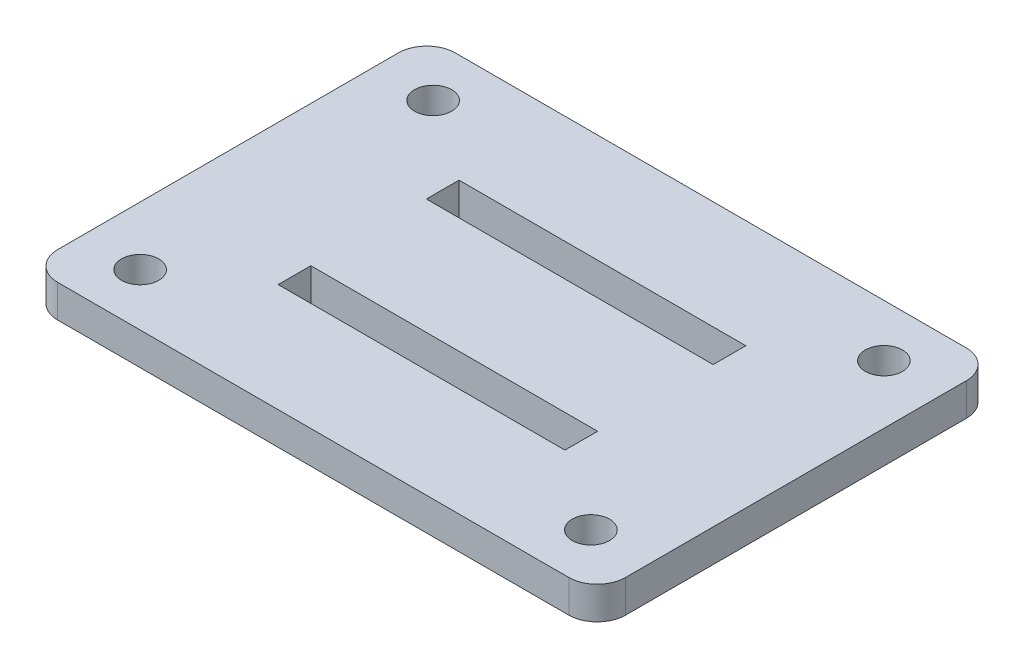
ISO-10303-21;
HEADER;
FILE_DESCRIPTION(('STEP AP214'),'2;1');
FILE_NAME('part.step','',(''),(''),'','','');
FILE_SCHEMA(('AUTOMOTIVE_DESIGN { 1 0 10303 214 1 1 1 1 }'));
ENDSEC;
DATA;
#1=APPLICATION_CONTEXT('core data for automotive mechanical design processes');
#2=APPLICATION_PROTOCOL_DEFINITION('international standard','automotive_design',2000,#1);
#3=PRODUCT_CONTEXT('',#1,'mechanical');
#4=PRODUCT('Part','Part','',(#3));
#5=PRODUCT_RELATED_PRODUCT_CATEGORY('part','',(#4));
#6=PRODUCT_DEFINITION_FORMATION('','',#4);
#7=PRODUCT_DEFINITION_CONTEXT('part definition',#1,'design');
#8=PRODUCT_DEFINITION('design','',#6,#7);
#9=PRODUCT_DEFINITION_SHAPE('','',#8);
#10=(LENGTH_UNIT() NAMED_UNIT(*) SI_UNIT(.MILLI.,.METRE.));
#11=(NAMED_UNIT(*) PLANE_ANGLE_UNIT() SI_UNIT($,.RADIAN.));
#12=(NAMED_UNIT(*) SI_UNIT($,.STERADIAN.) SOLID_ANGLE_UNIT());
#13=UNCERTAINTY_MEASURE_WITH_UNIT(LENGTH_MEASURE(1.E-05),#10,'distance_accuracy_value','');
#14=(GEOMETRIC_REPRESENTATION_CONTEXT(3) GLOBAL_UNCERTAINTY_ASSIGNED_CONTEXT((#13)) GLOBAL_UNIT_ASSIGNED_CONTEXT((#10,
#11,#12)) REPRESENTATION_CONTEXT('',''));
#15=CARTESIAN_POINT('',(0.,0.,0.));
#16=DIRECTION('',(0.,0.,1.));
#17=DIRECTION('',(1.,0.,0.));
#18=AXIS2_PLACEMENT_3D('',#15,#16,#17);
#19=CARTESIAN_POINT('',(40.,4.6,28.));
#20=DIRECTION('',(-1.,0.,0.));
#21=DIRECTION('',(0.,0.,1.));
#22=AXIS2_PLACEMENT_3D('',#19,#20,#21);
#23=PLANE('',#22);
#24=DIRECTION('',(0.,0.,-1.));
#25=VECTOR('',#24,1.);
#26=CARTESIAN_POINT('',(40.,0.,28.));
#27=LINE('',#26,#25);
#28=CARTESIAN_POINT('',(40.,0.,24.));
#29=VERTEX_POINT('',#28);
#30=CARTESIAN_POINT('',(40.,0.,-24.));
#31=VERTEX_POINT('',#30);
#32=EDGE_CURVE('E244',#29,#31,#27,.T.);
#33=ORIENTED_EDGE('',*,*,#32,.T.);
#34=DIRECTION('',(0.,-1.,0.));
#35=VECTOR('',#34,1.);
#36=CARTESIAN_POINT('',(40.,4.6,-24.));
#37=LINE('',#36,#35);
#38=CARTESIAN_POINT('',(40.,4.6,-24.));
#39=VERTEX_POINT('',#38);
#40=EDGE_CURVE('E293',#31,#39,#37,.F.);
#41=ORIENTED_EDGE('',*,*,#40,.T.);
#42=DIRECTION('',(0.,0.,-1.));
#43=VECTOR('',#42,1.);
#44=CARTESIAN_POINT('',(40.,4.6,28.));
#45=LINE('',#44,#43);
#46=CARTESIAN_POINT('',(40.,4.6,24.));
#47=VERTEX_POINT('',#46);
#48=EDGE_CURVE('E245',#47,#39,#45,.T.);
#49=ORIENTED_EDGE('',*,*,#48,.F.);
#50=DIRECTION('',(0.,-1.,0.));
#51=VECTOR('',#50,1.);
#52=CARTESIAN_POINT('',(40.,4.6,24.));
#53=LINE('',#52,#51);
#54=EDGE_CURVE('E290',#47,#29,#53,.T.);
#55=ORIENTED_EDGE('',*,*,#54,.T.);
#56=EDGE_LOOP('',(#33,#41,#49,#55));
#57=FACE_BOUND('',#56,.T.);
#58=ADVANCED_FACE('F43',(#57),#23,.F.);
#59=CARTESIAN_POINT('',(-40.,4.6,-28.));
#60=DIRECTION('',(0.,0.,1.));
#61=DIRECTION('',(1.,0.,0.));
#62=AXIS2_PLACEMENT_3D('',#59,#60,#61);
#63=PLANE('',#62);
#64=DIRECTION('',(-1.,0.,0.));
#65=VECTOR('',#64,1.);
#66=CARTESIAN_POINT('',(-40.,0.,-28.));
#67=LINE('',#66,#65);
#68=CARTESIAN_POINT('',(36.,0.,-28.));
#69=VERTEX_POINT('',#68);
#70=CARTESIAN_POINT('',(-36.,0.,-28.));
#71=VERTEX_POINT('',#70);
#72=EDGE_CURVE('E259',#69,#71,#67,.T.);
#73=ORIENTED_EDGE('',*,*,#72,.T.);
#74=DIRECTION('',(0.,-1.,0.));
#75=VECTOR('',#74,1.);
#76=CARTESIAN_POINT('',(-36.,4.6,-28.));
#77=LINE('',#76,#75);
#78=CARTESIAN_POINT('',(-36.,4.6,-28.));
#79=VERTEX_POINT('',#78);
#80=EDGE_CURVE('E281',#71,#79,#77,.F.);
#81=ORIENTED_EDGE('',*,*,#80,.T.);
#82=DIRECTION('',(-1.,0.,0.));
#83=VECTOR('',#82,1.);
#84=CARTESIAN_POINT('',(-40.,4.6,-28.));
#85=LINE('',#84,#83);
#86=CARTESIAN_POINT('',(36.,4.6,-28.));
#87=VERTEX_POINT('',#86);
#88=EDGE_CURVE('E248',#87,#79,#85,.T.);
#89=ORIENTED_EDGE('',*,*,#88,.F.);
#90=DIRECTION('',(0.,-1.,0.));
#91=VECTOR('',#90,1.);
#92=CARTESIAN_POINT('',(36.,4.6,-28.));
#93=LINE('',#92,#91);
#94=EDGE_CURVE('E278',#87,#69,#93,.T.);
#95=ORIENTED_EDGE('',*,*,#94,.T.);
#96=EDGE_LOOP('',(#73,#81,#89,#95));
#97=FACE_BOUND('',#96,.T.);
#98=ADVANCED_FACE('F317',(#97),#63,.F.);
#99=CARTESIAN_POINT('',(-40.,4.6,28.));
#100=DIRECTION('',(1.,0.,0.));
#101=DIRECTION('',(0.,0.,-1.));
#102=AXIS2_PLACEMENT_3D('',#99,#100,#101);
#103=PLANE('',#102);
#104=DIRECTION('',(0.,0.,1.));
#105=VECTOR('',#104,1.);
#106=CARTESIAN_POINT('',(-40.,4.6,28.));
#107=LINE('',#106,#105);
#108=CARTESIAN_POINT('',(-40.,4.6,-24.));
#109=VERTEX_POINT('',#108);
#110=CARTESIAN_POINT('',(-40.,4.6,24.));
#111=VERTEX_POINT('',#110);
#112=EDGE_CURVE('E252',#109,#111,#107,.T.);
#113=ORIENTED_EDGE('',*,*,#112,.F.);
#114=DIRECTION('',(0.,-1.,0.));
#115=VECTOR('',#114,1.);
#116=CARTESIAN_POINT('',(-40.,4.6,-24.));
#117=LINE('',#116,#115);
#118=CARTESIAN_POINT('',(-40.,0.,-24.));
#119=VERTEX_POINT('',#118);
#120=EDGE_CURVE('E267',#109,#119,#117,.T.);
#121=ORIENTED_EDGE('',*,*,#120,.T.);
#122=DIRECTION('',(0.,0.,1.));
#123=VECTOR('',#122,1.);
#124=CARTESIAN_POINT('',(-40.,0.,28.));
#125=LINE('',#124,#123);
#126=CARTESIAN_POINT('',(-40.,0.,24.));
#127=VERTEX_POINT('',#126);
#128=EDGE_CURVE('E262',#119,#127,#125,.T.);
#129=ORIENTED_EDGE('',*,*,#128,.T.);
#130=DIRECTION('',(0.,-1.,0.));
#131=VECTOR('',#130,1.);
#132=CARTESIAN_POINT('',(-40.,4.6,24.));
#133=LINE('',#132,#131);
#134=EDGE_CURVE('E256',#127,#111,#133,.F.);
#135=ORIENTED_EDGE('',*,*,#134,.T.);
#136=EDGE_LOOP('',(#113,#121,#129,#135));
#137=FACE_BOUND('',#136,.T.);
#138=ADVANCED_FACE('F325',(#137),#103,.F.);
#139=CARTESIAN_POINT('',(-40.,4.6,28.));
#140=DIRECTION('',(0.,0.,-1.));
#141=DIRECTION('',(-1.,0.,0.));
#142=AXIS2_PLACEMENT_3D('',#139,#140,#141);
#143=PLANE('',#142);
#144=DIRECTION('',(1.,0.,0.));
#145=VECTOR('',#144,1.);
#146=CARTESIAN_POINT('',(-40.,0.,28.));
#147=LINE('',#146,#145);
#148=CARTESIAN_POINT('',(-36.,0.,28.));
#149=VERTEX_POINT('',#148);
#150=CARTESIAN_POINT('',(36.,0.,28.));
#151=VERTEX_POINT('',#150);
#152=EDGE_CURVE('E249',#149,#151,#147,.T.);
#153=ORIENTED_EDGE('',*,*,#152,.T.);
#154=DIRECTION('',(0.,-1.,0.));
#155=VECTOR('',#154,1.);
#156=CARTESIAN_POINT('',(36.,4.6,28.));
#157=LINE('',#156,#155);
#158=CARTESIAN_POINT('',(36.,4.6,28.));
#159=VERTEX_POINT('',#158);
#160=EDGE_CURVE('E11',#151,#159,#157,.F.);
#161=ORIENTED_EDGE('',*,*,#160,.T.);
#162=DIRECTION('',(1.,0.,0.));
#163=VECTOR('',#162,1.);
#164=CARTESIAN_POINT('',(-40.,4.6,28.));
#165=LINE('',#164,#163);
#166=CARTESIAN_POINT('',(-36.,4.6,28.));
#167=VERTEX_POINT('',#166);
#168=EDGE_CURVE('E254',#167,#159,#165,.T.);
#169=ORIENTED_EDGE('',*,*,#168,.F.);
#170=DIRECTION('',(0.,-1.,0.));
#171=VECTOR('',#170,1.);
#172=CARTESIAN_POINT('',(-36.,4.6,28.));
#173=LINE('',#172,#171);
#174=EDGE_CURVE('E51',#167,#149,#173,.T.);
#175=ORIENTED_EDGE('',*,*,#174,.T.);
#176=EDGE_LOOP('',(#153,#161,#169,#175));
#177=FACE_BOUND('',#176,.T.);
#178=ADVANCED_FACE('F297',(#177),#143,.F.);
#179=CARTESIAN_POINT('',(0.,4.6,0.));
#180=DIRECTION('',(0.,-1.,0.));
#181=DIRECTION('',(0.,0.,-1.));
#182=AXIS2_PLACEMENT_3D('',#179,#180,#181);
#183=PLANE('',#182);
#184=DIRECTION('',(-1.,0.,0.));
#185=VECTOR('',#184,1.);
#186=CARTESIAN_POINT('',(-20.2,4.6,-8.13750000000002));
#187=LINE('',#186,#185);
#188=CARTESIAN_POINT('',(20.2,4.6,-8.13750000000002));
#189=VERTEX_POINT('',#188);
#190=CARTESIAN_POINT('',(-20.2,4.6,-8.13750000000002));
#191=VERTEX_POINT('',#190);
#192=EDGE_CURVE('E194',#189,#191,#187,.T.);
#193=ORIENTED_EDGE('',*,*,#192,.T.);
#194=DIRECTION('',(0.,0.,-1.));
#195=VECTOR('',#194,1.);
#196=CARTESIAN_POINT('',(-20.2,4.6,-12.7375));
#197=LINE('',#196,#195);
#198=CARTESIAN_POINT('',(-20.2,4.6,-12.7375));
#199=VERTEX_POINT('',#198);
#200=EDGE_CURVE('E198',#191,#199,#197,.T.);
#201=ORIENTED_EDGE('',*,*,#200,.T.);
#202=DIRECTION('',(1.,0.,0.));
#203=VECTOR('',#202,1.);
#204=CARTESIAN_POINT('',(-20.2,4.6,-12.7375));
#205=LINE('',#204,#203);
#206=CARTESIAN_POINT('',(20.2,4.6,-12.7375));
#207=VERTEX_POINT('',#206);
#208=EDGE_CURVE('E221',#199,#207,#205,.T.);
#209=ORIENTED_EDGE('',*,*,#208,.T.);
#210=DIRECTION('',(0.,0.,1.));
#211=VECTOR('',#210,1.);
#212=CARTESIAN_POINT('',(20.2,4.6,-12.7375));
#213=LINE('',#212,#211);
#214=EDGE_CURVE('E218',#207,#189,#213,.T.);
#215=ORIENTED_EDGE('',*,*,#214,.T.);
#216=EDGE_LOOP('',(#193,#201,#209,#215));
#217=FACE_BOUND('',#216,.T.);
#218=CARTESIAN_POINT('',(-31.75,4.6,20.6375));
#219=DIRECTION('',(0.,-1.,0.));
#220=DIRECTION('',(0.,0.,-1.));
#221=AXIS2_PLACEMENT_3D('',#218,#219,#220);
#222=CIRCLE('',#221,2.625);
#223=CARTESIAN_POINT('',(-31.75,4.6,18.0125));
#224=VERTEX_POINT('',#223);
#225=EDGE_CURVE('E186',#224,#224,#222,.T.);
#226=ORIENTED_EDGE('',*,*,#225,.T.);
#227=EDGE_LOOP('',(#226));
#228=FACE_BOUND('',#227,.T.);
#229=CARTESIAN_POINT('',(31.75,4.6,20.6375));
#230=DIRECTION('',(0.,-1.,0.));
#231=DIRECTION('',(0.,0.,-1.));
#232=AXIS2_PLACEMENT_3D('',#229,#230,#231);
#233=CIRCLE('',#232,2.625);
#234=CARTESIAN_POINT('',(31.75,4.6,18.0125));
#235=VERTEX_POINT('',#234);
#236=EDGE_CURVE('E193',#235,#235,#233,.T.);
#237=ORIENTED_EDGE('',*,*,#236,.T.);
#238=EDGE_LOOP('',(#237));
#239=FACE_BOUND('',#238,.T.);
#240=CARTESIAN_POINT('',(-31.75,4.6,-20.6375));
#241=DIRECTION('',(0.,-1.,0.));
#242=DIRECTION('',(0.,0.,-1.));
#243=AXIS2_PLACEMENT_3D('',#240,#241,#242);
#244=CIRCLE('',#243,2.625);
#245=CARTESIAN_POINT('',(-31.75,4.6,-23.2625));
#246=VERTEX_POINT('',#245);
#247=EDGE_CURVE('E227',#246,#246,#244,.T.);
#248=ORIENTED_EDGE('',*,*,#247,.T.);
#249=EDGE_LOOP('',(#248));
#250=FACE_BOUND('',#249,.T.);
#251=DIRECTION('',(1.,0.,0.));
#252=VECTOR('',#251,1.);
#253=CARTESIAN_POINT('',(-20.2,4.6,8.13750000000002));
#254=LINE('',#253,#252);
#255=CARTESIAN_POINT('',(-20.2,4.6,8.13750000000002));
#256=VERTEX_POINT('',#255);
#257=CARTESIAN_POINT('',(20.2,4.6,8.13750000000002));
#258=VERTEX_POINT('',#257);
#259=EDGE_CURVE('E181',#256,#258,#254,.T.);
#260=ORIENTED_EDGE('',*,*,#259,.T.);
#261=DIRECTION('',(0.,0.,1.));
#262=VECTOR('',#261,1.);
#263=CARTESIAN_POINT('',(20.2,4.6,12.7375));
#264=LINE('',#263,#262);
#265=CARTESIAN_POINT('',(20.2,4.6,12.7375));
#266=VERTEX_POINT('',#265);
#267=EDGE_CURVE('E166',#258,#266,#264,.T.);
#268=ORIENTED_EDGE('',*,*,#267,.T.);
#269=DIRECTION('',(-1.,0.,0.));
#270=VECTOR('',#269,1.);
#271=CARTESIAN_POINT('',(-20.2,4.6,12.7375));
#272=LINE('',#271,#270);
#273=CARTESIAN_POINT('',(-20.2,4.6,12.7375));
#274=VERTEX_POINT('',#273);
#275=EDGE_CURVE('E156',#266,#274,#272,.T.);
#276=ORIENTED_EDGE('',*,*,#275,.T.);
#277=DIRECTION('',(0.,0.,-1.));
#278=VECTOR('',#277,1.);
#279=CARTESIAN_POINT('',(-20.2,4.6,12.7375));
#280=LINE('',#279,#278);
#281=EDGE_CURVE('E167',#274,#256,#280,.T.);
#282=ORIENTED_EDGE('',*,*,#281,.T.);
#283=EDGE_LOOP('',(#260,#268,#276,#282));
#284=FACE_BOUND('',#283,.T.);
#285=CARTESIAN_POINT('',(31.75,4.6,-20.6375));
#286=DIRECTION('',(0.,-1.,0.));
#287=DIRECTION('',(0.,0.,-1.));
#288=AXIS2_PLACEMENT_3D('',#285,#286,#287);
#289=CIRCLE('',#288,2.625);
#290=CARTESIAN_POINT('',(31.75,4.6,-23.2625));
#291=VERTEX_POINT('',#290);
#292=EDGE_CURVE('E241',#291,#291,#289,.T.);
#293=ORIENTED_EDGE('',*,*,#292,.T.);
#294=EDGE_LOOP('',(#293));
#295=FACE_BOUND('',#294,.T.);
#296=ORIENTED_EDGE('',*,*,#88,.T.);
#297=CARTESIAN_POINT('',(-36.,4.6,-24.));
#298=DIRECTION('',(0.,-1.,0.));
#299=DIRECTION('',(0.,0.,-1.));
#300=AXIS2_PLACEMENT_3D('',#297,#298,#299);
#301=CIRCLE('',#300,4.);
#302=EDGE_CURVE('E288',#79,#109,#301,.F.);
#303=ORIENTED_EDGE('',*,*,#302,.T.);
#304=ORIENTED_EDGE('',*,*,#112,.T.);
#305=CARTESIAN_POINT('',(-36.,4.6,24.));
#306=DIRECTION('',(0.,-1.,0.));
#307=DIRECTION('',(0.,0.,-1.));
#308=AXIS2_PLACEMENT_3D('',#305,#306,#307);
#309=CIRCLE('',#308,4.);
#310=EDGE_CURVE('E63',#111,#167,#309,.F.);
#311=ORIENTED_EDGE('',*,*,#310,.T.);
#312=ORIENTED_EDGE('',*,*,#168,.T.);
#313=CARTESIAN_POINT('',(36.,4.6,24.));
#314=DIRECTION('',(0.,-1.,0.));
#315=DIRECTION('',(0.,0.,-1.));
#316=AXIS2_PLACEMENT_3D('',#313,#314,#315);
#317=CIRCLE('',#316,4.);
#318=EDGE_CURVE('E284',#159,#47,#317,.F.);
#319=ORIENTED_EDGE('',*,*,#318,.T.);
#320=ORIENTED_EDGE('',*,*,#48,.T.);
#321=CARTESIAN_POINT('',(36.,4.6,-24.));
#322=DIRECTION('',(0.,-1.,0.));
#323=DIRECTION('',(0.,0.,-1.));
#324=AXIS2_PLACEMENT_3D('',#321,#322,#323);
#325=CIRCLE('',#324,4.);
#326=EDGE_CURVE('E286',#39,#87,#325,.F.);
#327=ORIENTED_EDGE('',*,*,#326,.T.);
#328=EDGE_LOOP('',(#296,#303,#304,#311,#312,#319,#320,#327));
#329=FACE_BOUND('',#328,.T.);
#330=ADVANCED_FACE('F178',(#217,#228,#239,#250,#284,#295,#329),#183,.F.);
#331=CARTESIAN_POINT('',(0.,0.,0.));
#332=DIRECTION('',(0.,-1.,0.));
#333=DIRECTION('',(0.,0.,-1.));
#334=AXIS2_PLACEMENT_3D('',#331,#332,#333);
#335=PLANE('',#334);
#336=DIRECTION('',(0.,0.,1.));
#337=VECTOR('',#336,1.);
#338=CARTESIAN_POINT('',(-20.2,0.,-12.7375));
#339=LINE('',#338,#337);
#340=CARTESIAN_POINT('',(-20.2,0.,-12.7375));
#341=VERTEX_POINT('',#340);
#342=CARTESIAN_POINT('',(-20.2,0.,-8.13750000000002));
#343=VERTEX_POINT('',#342);
#344=EDGE_CURVE('E210',#341,#343,#339,.T.);
#345=ORIENTED_EDGE('',*,*,#344,.T.);
#346=DIRECTION('',(1.,0.,0.));
#347=VECTOR('',#346,1.);
#348=CARTESIAN_POINT('',(-20.2,0.,-8.13750000000002));
#349=LINE('',#348,#347);
#350=CARTESIAN_POINT('',(20.2,0.,-8.13750000000002));
#351=VERTEX_POINT('',#350);
#352=EDGE_CURVE('E207',#343,#351,#349,.T.);
#353=ORIENTED_EDGE('',*,*,#352,.T.);
#354=DIRECTION('',(0.,0.,-1.));
#355=VECTOR('',#354,1.);
#356=CARTESIAN_POINT('',(20.2,0.,-12.7375));
#357=LINE('',#356,#355);
#358=CARTESIAN_POINT('',(20.2,0.,-12.7375));
#359=VERTEX_POINT('',#358);
#360=EDGE_CURVE('E190',#351,#359,#357,.T.);
#361=ORIENTED_EDGE('',*,*,#360,.T.);
#362=DIRECTION('',(-1.,0.,0.));
#363=VECTOR('',#362,1.);
#364=CARTESIAN_POINT('',(-20.2,0.,-12.7375));
#365=LINE('',#364,#363);
#366=EDGE_CURVE('E213',#359,#341,#365,.T.);
#367=ORIENTED_EDGE('',*,*,#366,.T.);
#368=EDGE_LOOP('',(#345,#353,#361,#367));
#369=FACE_BOUND('',#368,.T.);
#370=CARTESIAN_POINT('',(-31.75,0.,20.6375));
#371=DIRECTION('',(0.,1.,0.));
#372=DIRECTION('',(0.,0.,-1.));
#373=AXIS2_PLACEMENT_3D('',#370,#371,#372);
#374=CIRCLE('',#373,2.625);
#375=CARTESIAN_POINT('',(-31.75,0.,18.0125));
#376=VERTEX_POINT('',#375);
#377=EDGE_CURVE('E189',#376,#376,#374,.T.);
#378=ORIENTED_EDGE('',*,*,#377,.T.);
#379=EDGE_LOOP('',(#378));
#380=FACE_BOUND('',#379,.T.);
#381=CARTESIAN_POINT('',(31.75,0.,20.6375));
#382=DIRECTION('',(0.,1.,0.));
#383=DIRECTION('',(0.,0.,1.));
#384=AXIS2_PLACEMENT_3D('',#381,#382,#383);
#385=CIRCLE('',#384,2.625);
#386=CARTESIAN_POINT('',(31.75,0.,23.2625));
#387=VERTEX_POINT('',#386);
#388=EDGE_CURVE('E231',#387,#387,#385,.T.);
#389=ORIENTED_EDGE('',*,*,#388,.T.);
#390=EDGE_LOOP('',(#389));
#391=FACE_BOUND('',#390,.T.);
#392=CARTESIAN_POINT('',(-31.75,0.,-20.6375));
#393=DIRECTION('',(0.,1.,0.));
#394=DIRECTION('',(0.,0.,1.));
#395=AXIS2_PLACEMENT_3D('',#392,#393,#394);
#396=CIRCLE('',#395,2.625);
#397=CARTESIAN_POINT('',(-31.75,0.,-18.0125));
#398=VERTEX_POINT('',#397);
#399=EDGE_CURVE('E230',#398,#398,#396,.T.);
#400=ORIENTED_EDGE('',*,*,#399,.T.);
#401=EDGE_LOOP('',(#400));
#402=FACE_BOUND('',#401,.T.);
#403=DIRECTION('',(0.,0.,-1.));
#404=VECTOR('',#403,1.);
#405=CARTESIAN_POINT('',(20.2,0.,12.7375));
#406=LINE('',#405,#404);
#407=CARTESIAN_POINT('',(20.2,0.,12.7375));
#408=VERTEX_POINT('',#407);
#409=CARTESIAN_POINT('',(20.2,0.,8.13750000000002));
#410=VERTEX_POINT('',#409);
#411=EDGE_CURVE('E173',#408,#410,#406,.T.);
#412=ORIENTED_EDGE('',*,*,#411,.T.);
#413=DIRECTION('',(-1.,0.,0.));
#414=VECTOR('',#413,1.);
#415=CARTESIAN_POINT('',(-20.2,0.,8.13750000000002));
#416=LINE('',#415,#414);
#417=CARTESIAN_POINT('',(-20.2,0.,8.13750000000002));
#418=VERTEX_POINT('',#417);
#419=EDGE_CURVE('E528',#410,#418,#416,.T.);
#420=ORIENTED_EDGE('',*,*,#419,.T.);
#421=DIRECTION('',(0.,0.,1.));
#422=VECTOR('',#421,1.);
#423=CARTESIAN_POINT('',(-20.2,0.,12.7375));
#424=LINE('',#423,#422);
#425=CARTESIAN_POINT('',(-20.2,0.,12.7375));
#426=VERTEX_POINT('',#425);
#427=EDGE_CURVE('E222',#418,#426,#424,.T.);
#428=ORIENTED_EDGE('',*,*,#427,.T.);
#429=DIRECTION('',(1.,0.,0.));
#430=VECTOR('',#429,1.);
#431=CARTESIAN_POINT('',(-20.2,0.,12.7375));
#432=LINE('',#431,#430);
#433=EDGE_CURVE('E529',#426,#408,#432,.T.);
#434=ORIENTED_EDGE('',*,*,#433,.T.);
#435=EDGE_LOOP('',(#412,#420,#428,#434));
#436=FACE_BOUND('',#435,.T.);
#437=CARTESIAN_POINT('',(31.75,0.,-20.6375));
#438=DIRECTION('',(0.,1.,0.));
#439=DIRECTION('',(0.,0.,-1.));
#440=AXIS2_PLACEMENT_3D('',#437,#438,#439);
#441=CIRCLE('',#440,2.625);
#442=CARTESIAN_POINT('',(31.75,0.,-23.2625));
#443=VERTEX_POINT('',#442);
#444=EDGE_CURVE('E234',#443,#443,#441,.T.);
#445=ORIENTED_EDGE('',*,*,#444,.T.);
#446=EDGE_LOOP('',(#445));
#447=FACE_BOUND('',#446,.T.);
#448=ORIENTED_EDGE('',*,*,#128,.F.);
#449=CARTESIAN_POINT('',(-36.,0.,-24.));
#450=DIRECTION('',(0.,-1.,0.));
#451=DIRECTION('',(0.,0.,-1.));
#452=AXIS2_PLACEMENT_3D('',#449,#450,#451);
#453=CIRCLE('',#452,4.);
#454=EDGE_CURVE('E276',#119,#71,#453,.T.);
#455=ORIENTED_EDGE('',*,*,#454,.T.);
#456=ORIENTED_EDGE('',*,*,#72,.F.);
#457=CARTESIAN_POINT('',(36.,0.,-24.));
#458=DIRECTION('',(0.,-1.,0.));
#459=DIRECTION('',(0.,0.,-1.));
#460=AXIS2_PLACEMENT_3D('',#457,#458,#459);
#461=CIRCLE('',#460,4.);
#462=EDGE_CURVE('E274',#69,#31,#461,.T.);
#463=ORIENTED_EDGE('',*,*,#462,.T.);
#464=ORIENTED_EDGE('',*,*,#32,.F.);
#465=CARTESIAN_POINT('',(36.,0.,24.));
#466=DIRECTION('',(0.,-1.,0.));
#467=DIRECTION('',(0.,0.,-1.));
#468=AXIS2_PLACEMENT_3D('',#465,#466,#467);
#469=CIRCLE('',#468,4.);
#470=EDGE_CURVE('E272',#29,#151,#469,.T.);
#471=ORIENTED_EDGE('',*,*,#470,.T.);
#472=ORIENTED_EDGE('',*,*,#152,.F.);
#473=CARTESIAN_POINT('',(-36.,0.,24.));
#474=DIRECTION('',(0.,-1.,0.));
#475=DIRECTION('',(0.,0.,-1.));
#476=AXIS2_PLACEMENT_3D('',#473,#474,#475);
#477=CIRCLE('',#476,4.);
#478=EDGE_CURVE('E270',#149,#127,#477,.T.);
#479=ORIENTED_EDGE('',*,*,#478,.T.);
#480=EDGE_LOOP('',(#448,#455,#456,#463,#464,#471,#472,#479));
#481=FACE_BOUND('',#480,.T.);
#482=ADVANCED_FACE('F301',(#369,#380,#391,#402,#436,#447,#481),#335,.T.);
#483=CARTESIAN_POINT('',(31.75,45.2610378618156,-20.6375));
#484=DIRECTION('',(0.,-1.,0.));
#485=DIRECTION('',(0.,0.,-1.));
#486=AXIS2_PLACEMENT_3D('',#483,#484,#485);
#487=CYLINDRICAL_SURFACE('',#486,2.625);
#488=ORIENTED_EDGE('',*,*,#292,.F.);
#489=EDGE_LOOP('',(#488));
#490=FACE_BOUND('',#489,.T.);
#491=ORIENTED_EDGE('',*,*,#444,.F.);
#492=EDGE_LOOP('',(#491));
#493=FACE_BOUND('',#492,.T.);
#494=ADVANCED_FACE('F457',(#490,#493),#487,.F.);
#495=CARTESIAN_POINT('',(-20.2,45.2610378618156,8.13750000000002));
#496=DIRECTION('',(0.,0.,1.));
#497=DIRECTION('',(1.,0.,0.));
#498=AXIS2_PLACEMENT_3D('',#495,#496,#497);
#499=PLANE('',#498);
#500=DIRECTION('',(0.,-1.,0.));
#501=VECTOR('',#500,1.);
#502=CARTESIAN_POINT('',(-20.2,45.2610378618156,8.13750000000002));
#503=LINE('',#502,#501);
#504=EDGE_CURVE('E532',#256,#418,#503,.T.);
#505=ORIENTED_EDGE('',*,*,#504,.T.);
#506=ORIENTED_EDGE('',*,*,#419,.F.);
#507=DIRECTION('',(0.,-1.,0.));
#508=VECTOR('',#507,1.);
#509=CARTESIAN_POINT('',(20.2,45.2610378618156,8.13750000000002));
#510=LINE('',#509,#508);
#511=EDGE_CURVE('E175',#258,#410,#510,.T.);
#512=ORIENTED_EDGE('',*,*,#511,.F.);
#513=ORIENTED_EDGE('',*,*,#259,.F.);
#514=EDGE_LOOP('',(#505,#506,#512,#513));
#515=FACE_BOUND('',#514,.T.);
#516=ADVANCED_FACE('F449',(#515),#499,.T.);
#517=CARTESIAN_POINT('',(20.2,45.2610378618156,12.7375));
#518=DIRECTION('',(-1.,0.,0.));
#519=DIRECTION('',(0.,0.,1.));
#520=AXIS2_PLACEMENT_3D('',#517,#518,#519);
#521=PLANE('',#520);
#522=ORIENTED_EDGE('',*,*,#511,.T.);
#523=ORIENTED_EDGE('',*,*,#411,.F.);
#524=DIRECTION('',(0.,-1.,0.));
#525=VECTOR('',#524,1.);
#526=CARTESIAN_POINT('',(20.2,45.2610378618156,12.7375));
#527=LINE('',#526,#525);
#528=EDGE_CURVE('E159',#266,#408,#527,.T.);
#529=ORIENTED_EDGE('',*,*,#528,.F.);
#530=ORIENTED_EDGE('',*,*,#267,.F.);
#531=EDGE_LOOP('',(#522,#523,#529,#530));
#532=FACE_BOUND('',#531,.T.);
#533=ADVANCED_FACE('F170',(#532),#521,.T.);
#534=CARTESIAN_POINT('',(-20.2,45.2610378618156,12.7375));
#535=DIRECTION('',(0.,0.,-1.));
#536=DIRECTION('',(-1.,0.,0.));
#537=AXIS2_PLACEMENT_3D('',#534,#535,#536);
#538=PLANE('',#537);
#539=ORIENTED_EDGE('',*,*,#528,.T.);
#540=ORIENTED_EDGE('',*,*,#433,.F.);
#541=DIRECTION('',(0.,-1.,0.));
#542=VECTOR('',#541,1.);
#543=CARTESIAN_POINT('',(-20.2,45.2610378618156,12.7375));
#544=LINE('',#543,#542);
#545=EDGE_CURVE('E162',#274,#426,#544,.T.);
#546=ORIENTED_EDGE('',*,*,#545,.F.);
#547=ORIENTED_EDGE('',*,*,#275,.F.);
#548=EDGE_LOOP('',(#539,#540,#546,#547));
#549=FACE_BOUND('',#548,.T.);
#550=ADVANCED_FACE('F158',(#549),#538,.T.);
#551=CARTESIAN_POINT('',(-20.2,45.2610378618156,12.7375));
#552=DIRECTION('',(1.,0.,0.));
#553=DIRECTION('',(0.,0.,-1.));
#554=AXIS2_PLACEMENT_3D('',#551,#552,#553);
#555=PLANE('',#554);
#556=ORIENTED_EDGE('',*,*,#545,.T.);
#557=ORIENTED_EDGE('',*,*,#427,.F.);
#558=ORIENTED_EDGE('',*,*,#504,.F.);
#559=ORIENTED_EDGE('',*,*,#281,.F.);
#560=EDGE_LOOP('',(#556,#557,#558,#559));
#561=FACE_BOUND('',#560,.T.);
#562=ADVANCED_FACE('F425',(#561),#555,.T.);
#563=CARTESIAN_POINT('',(-31.75,45.2610378618156,-20.6375));
#564=DIRECTION('',(0.,-1.,0.));
#565=DIRECTION('',(0.,0.,-1.));
#566=AXIS2_PLACEMENT_3D('',#563,#564,#565);
#567=CYLINDRICAL_SURFACE('',#566,2.625);
#568=ORIENTED_EDGE('',*,*,#247,.F.);
#569=EDGE_LOOP('',(#568));
#570=FACE_BOUND('',#569,.T.);
#571=ORIENTED_EDGE('',*,*,#399,.F.);
#572=EDGE_LOOP('',(#571));
#573=FACE_BOUND('',#572,.T.);
#574=ADVANCED_FACE('F416',(#570,#573),#567,.F.);
#575=CARTESIAN_POINT('',(31.75,45.2610378618156,20.6375));
#576=DIRECTION('',(0.,-1.,0.));
#577=DIRECTION('',(0.,0.,-1.));
#578=AXIS2_PLACEMENT_3D('',#575,#576,#577);
#579=CYLINDRICAL_SURFACE('',#578,2.625);
#580=ORIENTED_EDGE('',*,*,#236,.F.);
#581=EDGE_LOOP('',(#580));
#582=FACE_BOUND('',#581,.T.);
#583=ORIENTED_EDGE('',*,*,#388,.F.);
#584=EDGE_LOOP('',(#583));
#585=FACE_BOUND('',#584,.T.);
#586=ADVANCED_FACE('F407',(#582,#585),#579,.F.);
#587=CARTESIAN_POINT('',(-31.75,45.2610378618156,20.6375));
#588=DIRECTION('',(0.,-1.,0.));
#589=DIRECTION('',(0.,0.,-1.));
#590=AXIS2_PLACEMENT_3D('',#587,#588,#589);
#591=CYLINDRICAL_SURFACE('',#590,2.625);
#592=ORIENTED_EDGE('',*,*,#225,.F.);
#593=EDGE_LOOP('',(#592));
#594=FACE_BOUND('',#593,.T.);
#595=ORIENTED_EDGE('',*,*,#377,.F.);
#596=EDGE_LOOP('',(#595));
#597=FACE_BOUND('',#596,.T.);
#598=ADVANCED_FACE('F398',(#594,#597),#591,.F.);
#599=CARTESIAN_POINT('',(-20.2,45.2610378618156,-8.13750000000002));
#600=DIRECTION('',(0.,0.,-1.));
#601=DIRECTION('',(-1.,0.,0.));
#602=AXIS2_PLACEMENT_3D('',#599,#600,#601);
#603=PLANE('',#602);
#604=DIRECTION('',(0.,-1.,0.));
#605=VECTOR('',#604,1.);
#606=CARTESIAN_POINT('',(20.2,45.2610378618156,-8.13750000000002));
#607=LINE('',#606,#605);
#608=EDGE_CURVE('E205',#189,#351,#607,.T.);
#609=ORIENTED_EDGE('',*,*,#608,.T.);
#610=ORIENTED_EDGE('',*,*,#352,.F.);
#611=DIRECTION('',(0.,-1.,0.));
#612=VECTOR('',#611,1.);
#613=CARTESIAN_POINT('',(-20.2,45.2610378618156,-8.13750000000002));
#614=LINE('',#613,#612);
#615=EDGE_CURVE('E203',#191,#343,#614,.T.);
#616=ORIENTED_EDGE('',*,*,#615,.F.);
#617=ORIENTED_EDGE('',*,*,#192,.F.);
#618=EDGE_LOOP('',(#609,#610,#616,#617));
#619=FACE_BOUND('',#618,.T.);
#620=ADVANCED_FACE('F389',(#619),#603,.T.);
#621=CARTESIAN_POINT('',(-20.2,45.2610378618156,-12.7375));
#622=DIRECTION('',(1.,0.,0.));
#623=DIRECTION('',(0.,0.,-1.));
#624=AXIS2_PLACEMENT_3D('',#621,#622,#623);
#625=PLANE('',#624);
#626=ORIENTED_EDGE('',*,*,#615,.T.);
#627=ORIENTED_EDGE('',*,*,#344,.F.);
#628=DIRECTION('',(0.,-1.,0.));
#629=VECTOR('',#628,1.);
#630=CARTESIAN_POINT('',(-20.2,45.2610378618156,-12.7375));
#631=LINE('',#630,#629);
#632=EDGE_CURVE('E201',#199,#341,#631,.T.);
#633=ORIENTED_EDGE('',*,*,#632,.F.);
#634=ORIENTED_EDGE('',*,*,#200,.F.);
#635=EDGE_LOOP('',(#626,#627,#633,#634));
#636=FACE_BOUND('',#635,.T.);
#637=ADVANCED_FACE('F380',(#636),#625,.T.);
#638=CARTESIAN_POINT('',(-20.2,45.2610378618156,-12.7375));
#639=DIRECTION('',(0.,0.,1.));
#640=DIRECTION('',(1.,0.,0.));
#641=AXIS2_PLACEMENT_3D('',#638,#639,#640);
#642=PLANE('',#641);
#643=ORIENTED_EDGE('',*,*,#632,.T.);
#644=ORIENTED_EDGE('',*,*,#366,.F.);
#645=DIRECTION('',(0.,-1.,0.));
#646=VECTOR('',#645,1.);
#647=CARTESIAN_POINT('',(20.2,45.2610378618156,-12.7375));
#648=LINE('',#647,#646);
#649=EDGE_CURVE('E197',#207,#359,#648,.T.);
#650=ORIENTED_EDGE('',*,*,#649,.F.);
#651=ORIENTED_EDGE('',*,*,#208,.F.);
#652=EDGE_LOOP('',(#643,#644,#650,#651));
#653=FACE_BOUND('',#652,.T.);
#654=ADVANCED_FACE('F371',(#653),#642,.T.);
#655=CARTESIAN_POINT('',(20.2,45.2610378618156,-12.7375));
#656=DIRECTION('',(-1.,0.,0.));
#657=DIRECTION('',(0.,0.,1.));
#658=AXIS2_PLACEMENT_3D('',#655,#656,#657);
#659=PLANE('',#658);
#660=ORIENTED_EDGE('',*,*,#649,.T.);
#661=ORIENTED_EDGE('',*,*,#360,.F.);
#662=ORIENTED_EDGE('',*,*,#608,.F.);
#663=ORIENTED_EDGE('',*,*,#214,.F.);
#664=EDGE_LOOP('',(#660,#661,#662,#663));
#665=FACE_BOUND('',#664,.T.);
#666=ADVANCED_FACE('F342',(#665),#659,.T.);
#667=CARTESIAN_POINT('',(-36.,4.6,-24.));
#668=DIRECTION('',(0.,-1.,0.));
#669=DIRECTION('',(0.,0.,-1.));
#670=AXIS2_PLACEMENT_3D('',#667,#668,#669);
#671=CYLINDRICAL_SURFACE('',#670,4.);
#672=ORIENTED_EDGE('',*,*,#302,.F.);
#673=ORIENTED_EDGE('',*,*,#80,.F.);
#674=ORIENTED_EDGE('',*,*,#454,.F.);
#675=ORIENTED_EDGE('',*,*,#120,.F.);
#676=EDGE_LOOP('',(#672,#673,#674,#675));
#677=FACE_BOUND('',#676,.T.);
#678=ADVANCED_FACE('F322',(#677),#671,.T.);
#679=CARTESIAN_POINT('',(36.,4.6,-24.));
#680=DIRECTION('',(0.,-1.,0.));
#681=DIRECTION('',(0.,0.,-1.));
#682=AXIS2_PLACEMENT_3D('',#679,#680,#681);
#683=CYLINDRICAL_SURFACE('',#682,4.);
#684=ORIENTED_EDGE('',*,*,#326,.F.);
#685=ORIENTED_EDGE('',*,*,#40,.F.);
#686=ORIENTED_EDGE('',*,*,#462,.F.);
#687=ORIENTED_EDGE('',*,*,#94,.F.);
#688=EDGE_LOOP('',(#684,#685,#686,#687));
#689=FACE_BOUND('',#688,.T.);
#690=ADVANCED_FACE('F314',(#689),#683,.T.);
#691=CARTESIAN_POINT('',(36.,4.6,24.));
#692=DIRECTION('',(0.,-1.,0.));
#693=DIRECTION('',(0.,0.,-1.));
#694=AXIS2_PLACEMENT_3D('',#691,#692,#693);
#695=CYLINDRICAL_SURFACE('',#694,4.);
#696=ORIENTED_EDGE('',*,*,#318,.F.);
#697=ORIENTED_EDGE('',*,*,#160,.F.);
#698=ORIENTED_EDGE('',*,*,#470,.F.);
#699=ORIENTED_EDGE('',*,*,#54,.F.);
#700=EDGE_LOOP('',(#696,#697,#698,#699));
#701=FACE_BOUND('',#700,.T.);
#702=ADVANCED_FACE('F306',(#701),#695,.T.);
#703=CARTESIAN_POINT('',(-36.,4.6,24.));
#704=DIRECTION('',(0.,-1.,0.));
#705=DIRECTION('',(0.,0.,-1.));
#706=AXIS2_PLACEMENT_3D('',#703,#704,#705);
#707=CYLINDRICAL_SURFACE('',#706,4.);
#708=ORIENTED_EDGE('',*,*,#310,.F.);
#709=ORIENTED_EDGE('',*,*,#134,.F.);
#710=ORIENTED_EDGE('',*,*,#478,.F.);
#711=ORIENTED_EDGE('',*,*,#174,.F.);
#712=EDGE_LOOP('',(#708,#709,#710,#711));
#713=FACE_BOUND('',#712,.T.);
#714=ADVANCED_FACE('F45',(#713),#707,.T.);
#715=CLOSED_SHELL('',(#58,#98,#138,#178,#330,#482,#494,#516,#533,#550,#562,#574,#586,#598,#620,
#637,#654,#666,#678,#690,#702,#714));
#716=MANIFOLD_SOLID_BREP('B2',#715);
#717=ADVANCED_BREP_SHAPE_REPRESENTATION('',(#18,#716),#14);
#718=SHAPE_DEFINITION_REPRESENTATION(#9,#717);
ENDSEC;
END-ISO-10303-21;
